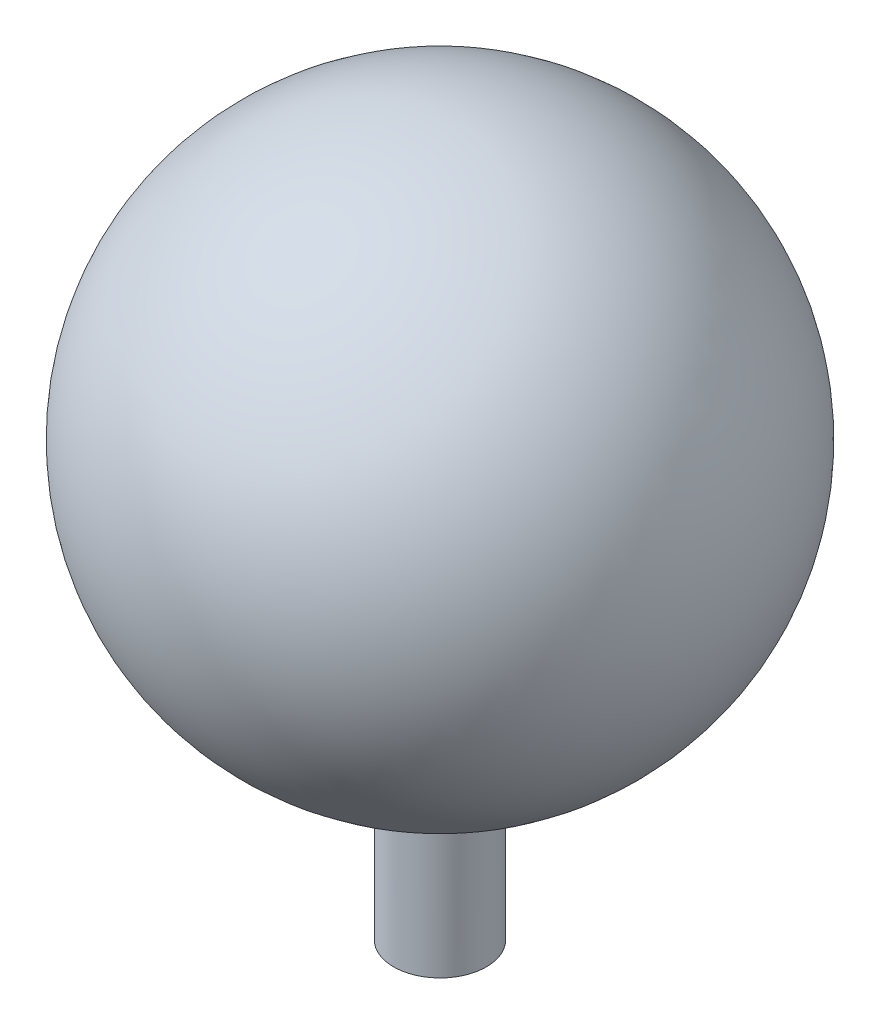
ISO-10303-21;
HEADER;
FILE_DESCRIPTION(('STEP AP214'),'2;1');
FILE_NAME('part.step','',(''),(''),'','','');
FILE_SCHEMA(('AUTOMOTIVE_DESIGN { 1 0 10303 214 1 1 1 1 }'));
ENDSEC;
DATA;
#1=APPLICATION_CONTEXT('core data for automotive mechanical design processes');
#2=APPLICATION_PROTOCOL_DEFINITION('international standard','automotive_design',2000,#1);
#3=PRODUCT_CONTEXT('',#1,'mechanical');
#4=PRODUCT('Part','Part','',(#3));
#5=PRODUCT_RELATED_PRODUCT_CATEGORY('part','',(#4));
#6=PRODUCT_DEFINITION_FORMATION('','',#4);
#7=PRODUCT_DEFINITION_CONTEXT('part definition',#1,'design');
#8=PRODUCT_DEFINITION('design','',#6,#7);
#9=PRODUCT_DEFINITION_SHAPE('','',#8);
#10=(LENGTH_UNIT() NAMED_UNIT(*) SI_UNIT(.MILLI.,.METRE.));
#11=(NAMED_UNIT(*) PLANE_ANGLE_UNIT() SI_UNIT($,.RADIAN.));
#12=(NAMED_UNIT(*) SI_UNIT($,.STERADIAN.) SOLID_ANGLE_UNIT());
#13=UNCERTAINTY_MEASURE_WITH_UNIT(LENGTH_MEASURE(1.E-05),#10,'distance_accuracy_value','');
#14=(GEOMETRIC_REPRESENTATION_CONTEXT(3) GLOBAL_UNCERTAINTY_ASSIGNED_CONTEXT((#13)) GLOBAL_UNIT_ASSIGNED_CONTEXT((#10,
#11,#12)) REPRESENTATION_CONTEXT('',''));
#15=CARTESIAN_POINT('',(0.,0.,0.));
#16=DIRECTION('',(0.,0.,1.));
#17=DIRECTION('',(1.,0.,0.));
#18=AXIS2_PLACEMENT_3D('',#15,#16,#17);
#19=CARTESIAN_POINT('',(0.,0.,0.));
#20=DIRECTION('',(0.,1.,0.));
#21=DIRECTION('',(1.,0.,0.));
#22=AXIS2_PLACEMENT_3D('',#19,#20,#21);
#23=SPHERICAL_SURFACE('',#22,4.5);
#24=CARTESIAN_POINT('',(0.,-4.43705983732471,0.));
#25=DIRECTION('',(0.,1.,0.));
#26=DIRECTION('',(-1.,0.,0.));
#27=AXIS2_PLACEMENT_3D('',#24,#25,#26);
#28=CIRCLE('',#27,0.75);
#29=CARTESIAN_POINT('',(-0.749999999999999,-4.43705983732471,0.));
#30=VERTEX_POINT('',#29);
#31=EDGE_CURVE('E37',#30,#30,#28,.T.);
#32=ORIENTED_EDGE('',*,*,#31,.T.);
#33=EDGE_LOOP('',(#32));
#34=FACE_BOUND('',#33,.T.);
#35=ADVANCED_FACE('F31',(#34),#23,.T.);
#36=CARTESIAN_POINT('',(0.,-7.,0.));
#37=DIRECTION('',(0.,1.,0.));
#38=DIRECTION('',(-1.,0.,0.));
#39=AXIS2_PLACEMENT_3D('',#36,#37,#38);
#40=PLANE('',#39);
#41=CARTESIAN_POINT('',(0.,-7.,0.));
#42=DIRECTION('',(0.,1.,0.));
#43=DIRECTION('',(-1.,0.,0.));
#44=AXIS2_PLACEMENT_3D('',#41,#42,#43);
#45=CIRCLE('',#44,0.75);
#46=CARTESIAN_POINT('',(-0.749999999999999,-7.,0.));
#47=VERTEX_POINT('',#46);
#48=EDGE_CURVE('E10',#47,#47,#45,.T.);
#49=ORIENTED_EDGE('',*,*,#48,.F.);
#50=EDGE_LOOP('',(#49));
#51=FACE_BOUND('',#50,.T.);
#52=ADVANCED_FACE('F46',(#51),#40,.F.);
#53=CARTESIAN_POINT('',(0.,4.5,0.));
#54=DIRECTION('',(0.,1.,0.));
#55=DIRECTION('',(-1.,0.,0.));
#56=AXIS2_PLACEMENT_3D('',#53,#54,#55);
#57=CYLINDRICAL_SURFACE('',#56,0.75);
#58=ORIENTED_EDGE('',*,*,#31,.F.);
#59=EDGE_LOOP('',(#58));
#60=FACE_BOUND('',#59,.T.);
#61=ORIENTED_EDGE('',*,*,#48,.T.);
#62=EDGE_LOOP('',(#61));
#63=FACE_BOUND('',#62,.T.);
#64=ADVANCED_FACE('F44',(#60,#63),#57,.T.);
#65=CLOSED_SHELL('',(#35,#52,#64));
#66=MANIFOLD_SOLID_BREP('B2',#65);
#67=ADVANCED_BREP_SHAPE_REPRESENTATION('',(#18,#66),#14);
#68=SHAPE_DEFINITION_REPRESENTATION(#9,#67);
ENDSEC;
END-ISO-10303-21;
